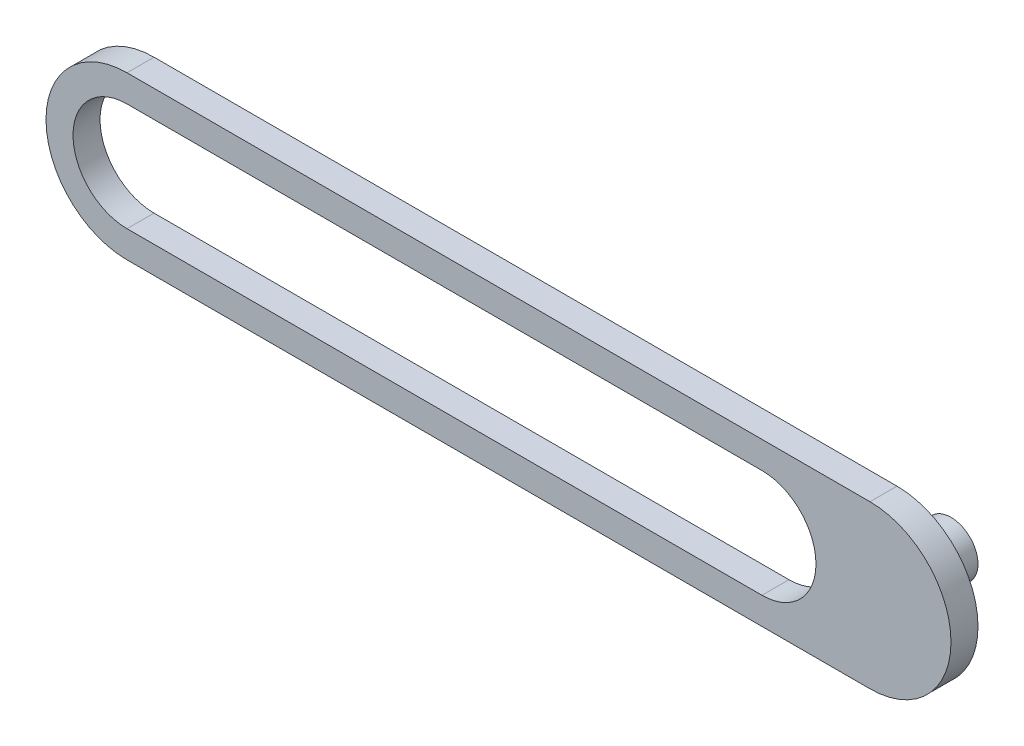
ISO-10303-21;
HEADER;
FILE_DESCRIPTION(('STEP AP214'),'2;1');
FILE_NAME('part.step','',(''),(''),'','','');
FILE_SCHEMA(('AUTOMOTIVE_DESIGN { 1 0 10303 214 1 1 1 1 }'));
ENDSEC;
DATA;
#1=APPLICATION_CONTEXT('core data for automotive mechanical design processes');
#2=APPLICATION_PROTOCOL_DEFINITION('international standard','automotive_design',2000,#1);
#3=PRODUCT_CONTEXT('',#1,'mechanical');
#4=PRODUCT('Part','Part','',(#3));
#5=PRODUCT_RELATED_PRODUCT_CATEGORY('part','',(#4));
#6=PRODUCT_DEFINITION_FORMATION('','',#4);
#7=PRODUCT_DEFINITION_CONTEXT('part definition',#1,'design');
#8=PRODUCT_DEFINITION('design','',#6,#7);
#9=PRODUCT_DEFINITION_SHAPE('','',#8);
#10=(LENGTH_UNIT() NAMED_UNIT(*) SI_UNIT(.MILLI.,.METRE.));
#11=(NAMED_UNIT(*) PLANE_ANGLE_UNIT() SI_UNIT($,.RADIAN.));
#12=(NAMED_UNIT(*) SI_UNIT($,.STERADIAN.) SOLID_ANGLE_UNIT());
#13=UNCERTAINTY_MEASURE_WITH_UNIT(LENGTH_MEASURE(1.E-05),#10,'distance_accuracy_value','');
#14=(GEOMETRIC_REPRESENTATION_CONTEXT(3) GLOBAL_UNCERTAINTY_ASSIGNED_CONTEXT((#13)) GLOBAL_UNIT_ASSIGNED_CONTEXT((#10,
#11,#12)) REPRESENTATION_CONTEXT('',''));
#15=CARTESIAN_POINT('',(0.,0.,0.));
#16=DIRECTION('',(0.,0.,1.));
#17=DIRECTION('',(1.,0.,0.));
#18=AXIS2_PLACEMENT_3D('',#15,#16,#17);
#19=CARTESIAN_POINT('',(-66.9032258064516,0.,5.));
#20=DIRECTION('',(0.,0.,-1.));
#21=DIRECTION('',(-1.,0.,0.));
#22=AXIS2_PLACEMENT_3D('',#19,#20,#21);
#23=CYLINDRICAL_SURFACE('',#22,15.);
#24=CARTESIAN_POINT('',(-66.9032258064516,0.,0.));
#25=DIRECTION('',(0.,0.,1.));
#26=DIRECTION('',(1.,0.,0.));
#27=AXIS2_PLACEMENT_3D('',#24,#25,#26);
#28=CIRCLE('',#27,15.);
#29=CARTESIAN_POINT('',(-66.9032258064516,15.,0.));
#30=VERTEX_POINT('',#29);
#31=CARTESIAN_POINT('',(-66.9032258064516,-15.,0.));
#32=VERTEX_POINT('',#31);
#33=EDGE_CURVE('E153',#30,#32,#28,.T.);
#34=ORIENTED_EDGE('',*,*,#33,.T.);
#35=DIRECTION('',(0.,0.,-1.));
#36=VECTOR('',#35,1.);
#37=CARTESIAN_POINT('',(-66.9032258064516,-15.,5.));
#38=LINE('',#37,#36);
#39=CARTESIAN_POINT('',(-66.9032258064516,-15.,5.));
#40=VERTEX_POINT('',#39);
#41=EDGE_CURVE('E11',#40,#32,#38,.T.);
#42=ORIENTED_EDGE('',*,*,#41,.F.);
#43=CARTESIAN_POINT('',(-66.9032258064516,0.,5.));
#44=DIRECTION('',(0.,0.,1.));
#45=DIRECTION('',(1.,0.,0.));
#46=AXIS2_PLACEMENT_3D('',#43,#44,#45);
#47=CIRCLE('',#46,15.);
#48=CARTESIAN_POINT('',(-66.9032258064516,15.,5.));
#49=VERTEX_POINT('',#48);
#50=EDGE_CURVE('E131',#49,#40,#47,.T.);
#51=ORIENTED_EDGE('',*,*,#50,.F.);
#52=DIRECTION('',(0.,0.,-1.));
#53=VECTOR('',#52,1.);
#54=CARTESIAN_POINT('',(-66.9032258064516,15.,5.));
#55=LINE('',#54,#53);
#56=EDGE_CURVE('E159',#49,#30,#55,.T.);
#57=ORIENTED_EDGE('',*,*,#56,.T.);
#58=EDGE_LOOP('',(#34,#42,#51,#57));
#59=FACE_BOUND('',#58,.T.);
#60=ADVANCED_FACE('F41',(#59),#23,.T.);
#61=CARTESIAN_POINT('',(0.,-15.,5.));
#62=DIRECTION('',(0.,-1.,0.));
#63=DIRECTION('',(1.,0.,0.));
#64=AXIS2_PLACEMENT_3D('',#61,#62,#63);
#65=PLANE('',#64);
#66=DIRECTION('',(-1.,0.,0.));
#67=VECTOR('',#66,1.);
#68=CARTESIAN_POINT('',(0.,-15.,0.));
#69=LINE('',#68,#67);
#70=CARTESIAN_POINT('',(70.6451612903226,-15.,0.));
#71=VERTEX_POINT('',#70);
#72=EDGE_CURVE('E123',#71,#32,#69,.T.);
#73=ORIENTED_EDGE('',*,*,#72,.F.);
#74=DIRECTION('',(0.,0.,-1.));
#75=VECTOR('',#74,1.);
#76=CARTESIAN_POINT('',(70.6451612903226,-15.,5.));
#77=LINE('',#76,#75);
#78=CARTESIAN_POINT('',(70.6451612903226,-15.,5.));
#79=VERTEX_POINT('',#78);
#80=EDGE_CURVE('E51',#79,#71,#77,.T.);
#81=ORIENTED_EDGE('',*,*,#80,.F.);
#82=DIRECTION('',(-1.,0.,0.));
#83=VECTOR('',#82,1.);
#84=CARTESIAN_POINT('',(0.,-15.,5.));
#85=LINE('',#84,#83);
#86=EDGE_CURVE('E121',#79,#40,#85,.T.);
#87=ORIENTED_EDGE('',*,*,#86,.T.);
#88=ORIENTED_EDGE('',*,*,#41,.T.);
#89=EDGE_LOOP('',(#73,#81,#87,#88));
#90=FACE_BOUND('',#89,.T.);
#91=ADVANCED_FACE('F119',(#90),#65,.T.);
#92=CARTESIAN_POINT('',(70.6451612903226,0.,5.));
#93=DIRECTION('',(0.,0.,-1.));
#94=DIRECTION('',(-1.,0.,0.));
#95=AXIS2_PLACEMENT_3D('',#92,#93,#94);
#96=CYLINDRICAL_SURFACE('',#95,15.);
#97=CARTESIAN_POINT('',(70.6451612903226,0.,0.));
#98=DIRECTION('',(0.,0.,1.));
#99=DIRECTION('',(1.,0.,0.));
#100=AXIS2_PLACEMENT_3D('',#97,#98,#99);
#101=CIRCLE('',#100,15.);
#102=CARTESIAN_POINT('',(70.6451612903226,15.,0.));
#103=VERTEX_POINT('',#102);
#104=EDGE_CURVE('E87',#71,#103,#101,.T.);
#105=ORIENTED_EDGE('',*,*,#104,.T.);
#106=DIRECTION('',(0.,0.,-1.));
#107=VECTOR('',#106,1.);
#108=CARTESIAN_POINT('',(70.6451612903226,15.,5.));
#109=LINE('',#108,#107);
#110=CARTESIAN_POINT('',(70.6451612903226,15.,5.));
#111=VERTEX_POINT('',#110);
#112=EDGE_CURVE('E124',#111,#103,#109,.T.);
#113=ORIENTED_EDGE('',*,*,#112,.F.);
#114=CARTESIAN_POINT('',(70.6451612903226,0.,5.));
#115=DIRECTION('',(0.,0.,1.));
#116=DIRECTION('',(1.,0.,0.));
#117=AXIS2_PLACEMENT_3D('',#114,#115,#116);
#118=CIRCLE('',#117,15.);
#119=EDGE_CURVE('E126',#79,#111,#118,.T.);
#120=ORIENTED_EDGE('',*,*,#119,.F.);
#121=ORIENTED_EDGE('',*,*,#80,.T.);
#122=EDGE_LOOP('',(#105,#113,#120,#121));
#123=FACE_BOUND('',#122,.T.);
#124=ADVANCED_FACE('F127',(#123),#96,.T.);
#125=CARTESIAN_POINT('',(0.,10.,5.));
#126=DIRECTION('',(0.,1.,0.));
#127=DIRECTION('',(-1.,0.,0.));
#128=AXIS2_PLACEMENT_3D('',#125,#126,#127);
#129=PLANE('',#128);
#130=DIRECTION('',(1.,0.,0.));
#131=VECTOR('',#130,1.);
#132=CARTESIAN_POINT('',(0.,10.,0.));
#133=LINE('',#132,#131);
#134=CARTESIAN_POINT('',(-66.9032258064516,10.,0.));
#135=VERTEX_POINT('',#134);
#136=CARTESIAN_POINT('',(50.6451612903226,10.,0.));
#137=VERTEX_POINT('',#136);
#138=EDGE_CURVE('E140',#135,#137,#133,.T.);
#139=ORIENTED_EDGE('',*,*,#138,.T.);
#140=DIRECTION('',(0.,0.,-1.));
#141=VECTOR('',#140,1.);
#142=CARTESIAN_POINT('',(50.6451612903226,10.,5.));
#143=LINE('',#142,#141);
#144=CARTESIAN_POINT('',(50.6451612903226,10.,5.));
#145=VERTEX_POINT('',#144);
#146=EDGE_CURVE('E45',#145,#137,#143,.T.);
#147=ORIENTED_EDGE('',*,*,#146,.F.);
#148=DIRECTION('',(1.,0.,0.));
#149=VECTOR('',#148,1.);
#150=CARTESIAN_POINT('',(0.,10.,5.));
#151=LINE('',#150,#149);
#152=CARTESIAN_POINT('',(-66.9032258064516,10.,5.));
#153=VERTEX_POINT('',#152);
#154=EDGE_CURVE('E102',#153,#145,#151,.T.);
#155=ORIENTED_EDGE('',*,*,#154,.F.);
#156=DIRECTION('',(0.,0.,-1.));
#157=VECTOR('',#156,1.);
#158=CARTESIAN_POINT('',(-66.9032258064516,10.,5.));
#159=LINE('',#158,#157);
#160=EDGE_CURVE('E139',#153,#135,#159,.T.);
#161=ORIENTED_EDGE('',*,*,#160,.T.);
#162=EDGE_LOOP('',(#139,#147,#155,#161));
#163=FACE_BOUND('',#162,.T.);
#164=ADVANCED_FACE('F43',(#163),#129,.F.);
#165=CARTESIAN_POINT('',(50.6451612903226,0.,5.));
#166=DIRECTION('',(0.,0.,-1.));
#167=DIRECTION('',(-1.,0.,0.));
#168=AXIS2_PLACEMENT_3D('',#165,#166,#167);
#169=CYLINDRICAL_SURFACE('',#168,10.);
#170=CARTESIAN_POINT('',(50.6451612903226,0.,0.));
#171=DIRECTION('',(0.,0.,1.));
#172=DIRECTION('',(1.,0.,0.));
#173=AXIS2_PLACEMENT_3D('',#170,#171,#172);
#174=CIRCLE('',#173,10.);
#175=CARTESIAN_POINT('',(50.6451612903226,-10.,0.));
#176=VERTEX_POINT('',#175);
#177=EDGE_CURVE('E143',#176,#137,#174,.T.);
#178=ORIENTED_EDGE('',*,*,#177,.F.);
#179=DIRECTION('',(0.,0.,-1.));
#180=VECTOR('',#179,1.);
#181=CARTESIAN_POINT('',(50.6451612903226,-10.,5.));
#182=LINE('',#181,#180);
#183=CARTESIAN_POINT('',(50.6451612903226,-10.,5.));
#184=VERTEX_POINT('',#183);
#185=EDGE_CURVE('E164',#184,#176,#182,.T.);
#186=ORIENTED_EDGE('',*,*,#185,.F.);
#187=CARTESIAN_POINT('',(50.6451612903226,0.,5.));
#188=DIRECTION('',(0.,0.,1.));
#189=DIRECTION('',(1.,0.,0.));
#190=AXIS2_PLACEMENT_3D('',#187,#188,#189);
#191=CIRCLE('',#190,10.);
#192=EDGE_CURVE('E172',#184,#145,#191,.T.);
#193=ORIENTED_EDGE('',*,*,#192,.T.);
#194=ORIENTED_EDGE('',*,*,#146,.T.);
#195=EDGE_LOOP('',(#178,#186,#193,#194));
#196=FACE_BOUND('',#195,.T.);
#197=ADVANCED_FACE('F171',(#196),#169,.F.);
#198=CARTESIAN_POINT('',(0.,-10.,5.));
#199=DIRECTION('',(0.,1.,0.));
#200=DIRECTION('',(0.,0.,1.));
#201=AXIS2_PLACEMENT_3D('',#198,#199,#200);
#202=PLANE('',#201);
#203=DIRECTION('',(1.,0.,0.));
#204=VECTOR('',#203,1.);
#205=CARTESIAN_POINT('',(0.,-10.,0.));
#206=LINE('',#205,#204);
#207=CARTESIAN_POINT('',(-66.9032258064516,-10.,0.));
#208=VERTEX_POINT('',#207);
#209=EDGE_CURVE('E147',#208,#176,#206,.T.);
#210=ORIENTED_EDGE('',*,*,#209,.F.);
#211=DIRECTION('',(0.,0.,-1.));
#212=VECTOR('',#211,1.);
#213=CARTESIAN_POINT('',(-66.9032258064516,-10.,5.));
#214=LINE('',#213,#212);
#215=CARTESIAN_POINT('',(-66.9032258064516,-10.,5.));
#216=VERTEX_POINT('',#215);
#217=EDGE_CURVE('E163',#216,#208,#214,.T.);
#218=ORIENTED_EDGE('',*,*,#217,.F.);
#219=DIRECTION('',(1.,0.,0.));
#220=VECTOR('',#219,1.);
#221=CARTESIAN_POINT('',(0.,-10.,5.));
#222=LINE('',#221,#220);
#223=EDGE_CURVE('E181',#216,#184,#222,.T.);
#224=ORIENTED_EDGE('',*,*,#223,.T.);
#225=ORIENTED_EDGE('',*,*,#185,.T.);
#226=EDGE_LOOP('',(#210,#218,#224,#225));
#227=FACE_BOUND('',#226,.T.);
#228=ADVANCED_FACE('F179',(#227),#202,.T.);
#229=CARTESIAN_POINT('',(-66.9032258064516,0.,5.));
#230=DIRECTION('',(0.,0.,-1.));
#231=DIRECTION('',(-1.,0.,0.));
#232=AXIS2_PLACEMENT_3D('',#229,#230,#231);
#233=CYLINDRICAL_SURFACE('',#232,10.);
#234=CARTESIAN_POINT('',(-66.9032258064516,0.,0.));
#235=DIRECTION('',(0.,0.,1.));
#236=DIRECTION('',(1.,0.,0.));
#237=AXIS2_PLACEMENT_3D('',#234,#235,#236);
#238=CIRCLE('',#237,10.);
#239=EDGE_CURVE('E150',#135,#208,#238,.T.);
#240=ORIENTED_EDGE('',*,*,#239,.F.);
#241=ORIENTED_EDGE('',*,*,#160,.F.);
#242=CARTESIAN_POINT('',(-66.9032258064516,0.,5.));
#243=DIRECTION('',(0.,0.,1.));
#244=DIRECTION('',(1.,0.,0.));
#245=AXIS2_PLACEMENT_3D('',#242,#243,#244);
#246=CIRCLE('',#245,10.);
#247=EDGE_CURVE('E134',#153,#216,#246,.T.);
#248=ORIENTED_EDGE('',*,*,#247,.T.);
#249=ORIENTED_EDGE('',*,*,#217,.T.);
#250=EDGE_LOOP('',(#240,#241,#248,#249));
#251=FACE_BOUND('',#250,.T.);
#252=ADVANCED_FACE('F185',(#251),#233,.F.);
#253=CARTESIAN_POINT('',(0.,15.,5.));
#254=DIRECTION('',(0.,-1.,0.));
#255=DIRECTION('',(1.,0.,0.));
#256=AXIS2_PLACEMENT_3D('',#253,#254,#255);
#257=PLANE('',#256);
#258=DIRECTION('',(-1.,0.,0.));
#259=VECTOR('',#258,1.);
#260=CARTESIAN_POINT('',(0.,15.,0.));
#261=LINE('',#260,#259);
#262=EDGE_CURVE('E93',#103,#30,#261,.T.);
#263=ORIENTED_EDGE('',*,*,#262,.T.);
#264=ORIENTED_EDGE('',*,*,#56,.F.);
#265=DIRECTION('',(-1.,0.,0.));
#266=VECTOR('',#265,1.);
#267=CARTESIAN_POINT('',(0.,15.,5.));
#268=LINE('',#267,#266);
#269=EDGE_CURVE('E60',#111,#49,#268,.T.);
#270=ORIENTED_EDGE('',*,*,#269,.F.);
#271=ORIENTED_EDGE('',*,*,#112,.T.);
#272=EDGE_LOOP('',(#263,#264,#270,#271));
#273=FACE_BOUND('',#272,.T.);
#274=ADVANCED_FACE('F216',(#273),#257,.F.);
#275=CARTESIAN_POINT('',(0.,0.,5.));
#276=DIRECTION('',(0.,0.,1.));
#277=DIRECTION('',(1.,0.,0.));
#278=AXIS2_PLACEMENT_3D('',#275,#276,#277);
#279=PLANE('',#278);
#280=ORIENTED_EDGE('',*,*,#154,.T.);
#281=ORIENTED_EDGE('',*,*,#192,.F.);
#282=ORIENTED_EDGE('',*,*,#223,.F.);
#283=ORIENTED_EDGE('',*,*,#247,.F.);
#284=EDGE_LOOP('',(#280,#281,#282,#283));
#285=FACE_BOUND('',#284,.T.);
#286=ORIENTED_EDGE('',*,*,#50,.T.);
#287=ORIENTED_EDGE('',*,*,#86,.F.);
#288=ORIENTED_EDGE('',*,*,#119,.T.);
#289=ORIENTED_EDGE('',*,*,#269,.T.);
#290=EDGE_LOOP('',(#286,#287,#288,#289));
#291=FACE_BOUND('',#290,.T.);
#292=ADVANCED_FACE('F129',(#285,#291),#279,.T.);
#293=CARTESIAN_POINT('',(0.,0.,0.));
#294=DIRECTION('',(0.,0.,1.));
#295=DIRECTION('',(1.,0.,0.));
#296=AXIS2_PLACEMENT_3D('',#293,#294,#295);
#297=PLANE('',#296);
#298=CARTESIAN_POINT('',(70.6451612903226,0.,0.));
#299=DIRECTION('',(0.,0.,1.));
#300=DIRECTION('',(1.,0.,0.));
#301=AXIS2_PLACEMENT_3D('',#298,#299,#300);
#302=CIRCLE('',#301,5.);
#303=CARTESIAN_POINT('',(75.6451612903226,0.,0.));
#304=VERTEX_POINT('',#303);
#305=EDGE_CURVE('E189',#304,#304,#302,.T.);
#306=ORIENTED_EDGE('',*,*,#305,.T.);
#307=EDGE_LOOP('',(#306));
#308=FACE_BOUND('',#307,.T.);
#309=ORIENTED_EDGE('',*,*,#138,.F.);
#310=ORIENTED_EDGE('',*,*,#239,.T.);
#311=ORIENTED_EDGE('',*,*,#209,.T.);
#312=ORIENTED_EDGE('',*,*,#177,.T.);
#313=EDGE_LOOP('',(#309,#310,#311,#312));
#314=FACE_BOUND('',#313,.T.);
#315=ORIENTED_EDGE('',*,*,#33,.F.);
#316=ORIENTED_EDGE('',*,*,#262,.F.);
#317=ORIENTED_EDGE('',*,*,#104,.F.);
#318=ORIENTED_EDGE('',*,*,#72,.T.);
#319=EDGE_LOOP('',(#315,#316,#317,#318));
#320=FACE_BOUND('',#319,.T.);
#321=ADVANCED_FACE('F177',(#308,#314,#320),#297,.F.);
#322=CARTESIAN_POINT('',(70.6451612903226,0.,-10.));
#323=DIRECTION('',(0.,0.,1.));
#324=DIRECTION('',(1.,0.,0.));
#325=AXIS2_PLACEMENT_3D('',#322,#323,#324);
#326=CYLINDRICAL_SURFACE('',#325,5.);
#327=CARTESIAN_POINT('',(70.6451612903226,0.,-10.));
#328=DIRECTION('',(0.,0.,1.));
#329=DIRECTION('',(1.,0.,0.));
#330=AXIS2_PLACEMENT_3D('',#327,#328,#329);
#331=CIRCLE('',#330,5.);
#332=CARTESIAN_POINT('',(75.6451612903226,0.,-10.));
#333=VERTEX_POINT('',#332);
#334=EDGE_CURVE('E144',#333,#333,#331,.T.);
#335=ORIENTED_EDGE('',*,*,#334,.T.);
#336=EDGE_LOOP('',(#335));
#337=FACE_BOUND('',#336,.T.);
#338=ORIENTED_EDGE('',*,*,#305,.F.);
#339=EDGE_LOOP('',(#338));
#340=FACE_BOUND('',#339,.T.);
#341=ADVANCED_FACE('F195',(#337,#340),#326,.T.);
#342=CARTESIAN_POINT('',(70.6451612903226,0.,-10.));
#343=DIRECTION('',(0.,0.,1.));
#344=DIRECTION('',(1.,0.,0.));
#345=AXIS2_PLACEMENT_3D('',#342,#343,#344);
#346=PLANE('',#345);
#347=ORIENTED_EDGE('',*,*,#334,.F.);
#348=EDGE_LOOP('',(#347));
#349=FACE_BOUND('',#348,.T.);
#350=ADVANCED_FACE('F198',(#349),#346,.F.);
#351=CLOSED_SHELL('',(#60,#91,#124,#164,#197,#228,#252,#274,#292,#321,#341,#350));
#352=MANIFOLD_SOLID_BREP('B2',#351);
#353=ADVANCED_BREP_SHAPE_REPRESENTATION('',(#18,#352),#14);
#354=SHAPE_DEFINITION_REPRESENTATION(#9,#353);
ENDSEC;
END-ISO-10303-21;
